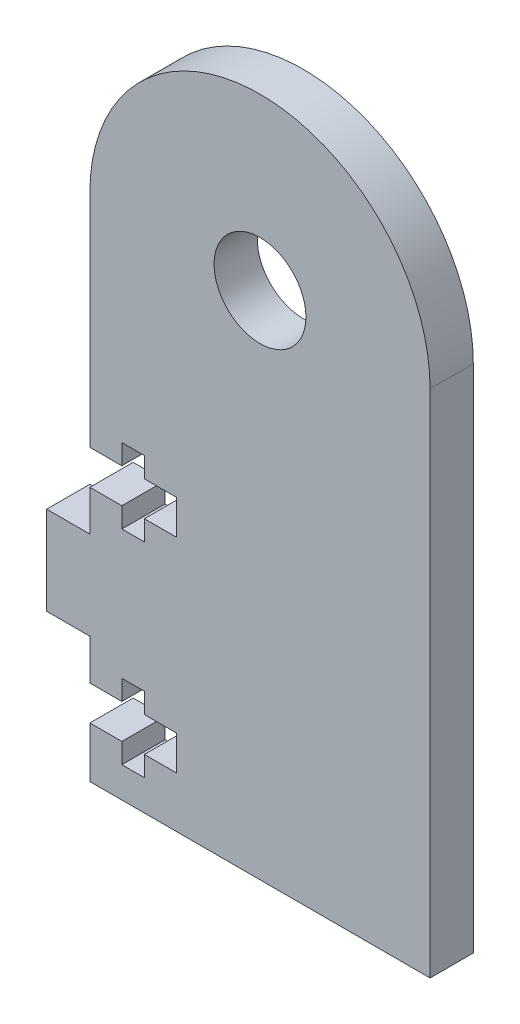
ISO-10303-21;
HEADER;
FILE_DESCRIPTION(('STEP AP214'),'2;1');
FILE_NAME('part.step','',(''),(''),'','','');
FILE_SCHEMA(('AUTOMOTIVE_DESIGN { 1 0 10303 214 1 1 1 1 }'));
ENDSEC;
DATA;
#1=APPLICATION_CONTEXT('core data for automotive mechanical design processes');
#2=APPLICATION_PROTOCOL_DEFINITION('international standard','automotive_design',2000,#1);
#3=PRODUCT_CONTEXT('',#1,'mechanical');
#4=PRODUCT('Part','Part','',(#3));
#5=PRODUCT_RELATED_PRODUCT_CATEGORY('part','',(#4));
#6=PRODUCT_DEFINITION_FORMATION('','',#4);
#7=PRODUCT_DEFINITION_CONTEXT('part definition',#1,'design');
#8=PRODUCT_DEFINITION('design','',#6,#7);
#9=PRODUCT_DEFINITION_SHAPE('','',#8);
#10=(LENGTH_UNIT() NAMED_UNIT(*) SI_UNIT(.MILLI.,.METRE.));
#11=(NAMED_UNIT(*) PLANE_ANGLE_UNIT() SI_UNIT($,.RADIAN.));
#12=(NAMED_UNIT(*) SI_UNIT($,.STERADIAN.) SOLID_ANGLE_UNIT());
#13=UNCERTAINTY_MEASURE_WITH_UNIT(LENGTH_MEASURE(1.E-05),#10,'distance_accuracy_value','');
#14=(GEOMETRIC_REPRESENTATION_CONTEXT(3) GLOBAL_UNCERTAINTY_ASSIGNED_CONTEXT((#13)) GLOBAL_UNIT_ASSIGNED_CONTEXT((#10,
#11,#12)) REPRESENTATION_CONTEXT('',''));
#15=CARTESIAN_POINT('',(0.,0.,0.));
#16=DIRECTION('',(0.,0.,1.));
#17=DIRECTION('',(1.,0.,0.));
#18=AXIS2_PLACEMENT_3D('',#15,#16,#17);
#19=CARTESIAN_POINT('',(-25.,0.,6.35));
#20=DIRECTION('',(1.,0.,0.));
#21=DIRECTION('',(0.,1.,0.));
#22=AXIS2_PLACEMENT_3D('',#19,#20,#21);
#23=PLANE('',#22);
#24=DIRECTION('',(0.,-1.,0.));
#25=VECTOR('',#24,1.);
#26=CARTESIAN_POINT('',(-25.,0.,6.35));
#27=LINE('',#26,#25);
#28=CARTESIAN_POINT('',(-25.,-56.5,6.35));
#29=VERTEX_POINT('',#28);
#30=CARTESIAN_POINT('',(-25.,-62.46,6.35));
#31=VERTEX_POINT('',#30);
#32=EDGE_CURVE('E48',#29,#31,#27,.T.);
#33=ORIENTED_EDGE('',*,*,#32,.F.);
#34=DIRECTION('',(0.,0.,1.));
#35=VECTOR('',#34,1.);
#36=CARTESIAN_POINT('',(-25.,-56.5,0.));
#37=LINE('',#36,#35);
#38=CARTESIAN_POINT('',(-25.,-56.5,0.));
#39=VERTEX_POINT('',#38);
#40=EDGE_CURVE('E279',#39,#29,#37,.T.);
#41=ORIENTED_EDGE('',*,*,#40,.F.);
#42=DIRECTION('',(0.,-1.,0.));
#43=VECTOR('',#42,1.);
#44=CARTESIAN_POINT('',(-25.,0.,0.));
#45=LINE('',#44,#43);
#46=CARTESIAN_POINT('',(-25.,-62.46,0.));
#47=VERTEX_POINT('',#46);
#48=EDGE_CURVE('E486',#39,#47,#45,.T.);
#49=ORIENTED_EDGE('',*,*,#48,.T.);
#50=DIRECTION('',(0.,0.,1.));
#51=VECTOR('',#50,1.);
#52=CARTESIAN_POINT('',(-25.,-62.46,0.));
#53=LINE('',#52,#51);
#54=EDGE_CURVE('E453',#47,#31,#53,.T.);
#55=ORIENTED_EDGE('',*,*,#54,.T.);
#56=EDGE_LOOP('',(#33,#41,#49,#55));
#57=FACE_BOUND('',#56,.T.);
#58=ADVANCED_FACE('F33',(#57),#23,.F.);
#59=CARTESIAN_POINT('',(-25.,-37.54,0.));
#60=VERTEX_POINT('',#59);
#61=CARTESIAN_POINT('',(-25.,-43.5,0.));
#62=VERTEX_POINT('',#61);
#63=EDGE_CURVE('E485',#60,#62,#45,.T.);
#64=ORIENTED_EDGE('',*,*,#63,.T.);
#65=DIRECTION('',(0.,0.,1.));
#66=VECTOR('',#65,1.);
#67=CARTESIAN_POINT('',(-25.,-43.5,0.));
#68=LINE('',#67,#66);
#69=CARTESIAN_POINT('',(-25.,-43.5,6.35));
#70=VERTEX_POINT('',#69);
#71=EDGE_CURVE('E56',#62,#70,#68,.T.);
#72=ORIENTED_EDGE('',*,*,#71,.T.);
#73=CARTESIAN_POINT('',(-25.,-37.54,6.35));
#74=VERTEX_POINT('',#73);
#75=EDGE_CURVE('E473',#74,#70,#27,.T.);
#76=ORIENTED_EDGE('',*,*,#75,.F.);
#77=DIRECTION('',(0.,0.,1.));
#78=VECTOR('',#77,1.);
#79=CARTESIAN_POINT('',(-25.,-37.54,0.));
#80=LINE('',#79,#78);
#81=EDGE_CURVE('E360',#60,#74,#80,.T.);
#82=ORIENTED_EDGE('',*,*,#81,.F.);
#83=EDGE_LOOP('',(#64,#72,#76,#82));
#84=FACE_BOUND('',#83,.T.);
#85=ADVANCED_FACE('F521',(#84),#23,.F.);
#86=CARTESIAN_POINT('',(-25.,-67.54,6.35));
#87=VERTEX_POINT('',#86);
#88=CARTESIAN_POINT('',(-25.,-75.,6.35));
#89=VERTEX_POINT('',#88);
#90=EDGE_CURVE('E467',#87,#89,#27,.T.);
#91=ORIENTED_EDGE('',*,*,#90,.F.);
#92=DIRECTION('',(0.,0.,1.));
#93=VECTOR('',#92,1.);
#94=CARTESIAN_POINT('',(-25.,-67.54,0.));
#95=LINE('',#94,#93);
#96=CARTESIAN_POINT('',(-25.,-67.54,0.));
#97=VERTEX_POINT('',#96);
#98=EDGE_CURVE('E451',#97,#87,#95,.T.);
#99=ORIENTED_EDGE('',*,*,#98,.F.);
#100=CARTESIAN_POINT('',(-25.,-75.,0.));
#101=VERTEX_POINT('',#100);
#102=EDGE_CURVE('E480',#97,#101,#45,.T.);
#103=ORIENTED_EDGE('',*,*,#102,.T.);
#104=DIRECTION('',(0.,0.,-1.));
#105=VECTOR('',#104,1.);
#106=CARTESIAN_POINT('',(-25.,-75.,6.35));
#107=LINE('',#106,#105);
#108=EDGE_CURVE('E41',#89,#101,#107,.T.);
#109=ORIENTED_EDGE('',*,*,#108,.F.);
#110=EDGE_LOOP('',(#91,#99,#103,#109));
#111=FACE_BOUND('',#110,.T.);
#112=ADVANCED_FACE('F523',(#111),#23,.F.);
#113=CARTESIAN_POINT('',(0.,0.,6.35));
#114=DIRECTION('',(0.,0.,-1.));
#115=DIRECTION('',(-1.,0.,0.));
#116=AXIS2_PLACEMENT_3D('',#113,#114,#115);
#117=CYLINDRICAL_SURFACE('',#116,25.);
#118=CARTESIAN_POINT('',(0.,0.,0.));
#119=DIRECTION('',(0.,0.,1.));
#120=DIRECTION('',(1.,0.,0.));
#121=AXIS2_PLACEMENT_3D('',#118,#119,#120);
#122=CIRCLE('',#121,25.);
#123=CARTESIAN_POINT('',(25.,0.,0.));
#124=VERTEX_POINT('',#123);
#125=CARTESIAN_POINT('',(-25.,0.,0.));
#126=VERTEX_POINT('',#125);
#127=EDGE_CURVE('E442',#124,#126,#122,.T.);
#128=ORIENTED_EDGE('',*,*,#127,.T.);
#129=DIRECTION('',(0.,0.,-1.));
#130=VECTOR('',#129,1.);
#131=CARTESIAN_POINT('',(-25.,0.,6.35));
#132=LINE('',#131,#130);
#133=CARTESIAN_POINT('',(-25.,0.,6.35));
#134=VERTEX_POINT('',#133);
#135=EDGE_CURVE('E11',#134,#126,#132,.T.);
#136=ORIENTED_EDGE('',*,*,#135,.F.);
#137=CARTESIAN_POINT('',(0.,0.,6.35));
#138=DIRECTION('',(0.,0.,1.));
#139=DIRECTION('',(1.,0.,0.));
#140=AXIS2_PLACEMENT_3D('',#137,#138,#139);
#141=CIRCLE('',#140,25.);
#142=CARTESIAN_POINT('',(25.,0.,6.35));
#143=VERTEX_POINT('',#142);
#144=EDGE_CURVE('E464',#143,#134,#141,.T.);
#145=ORIENTED_EDGE('',*,*,#144,.F.);
#146=DIRECTION('',(0.,0.,-1.));
#147=VECTOR('',#146,1.);
#148=CARTESIAN_POINT('',(25.,0.,6.35));
#149=LINE('',#148,#147);
#150=EDGE_CURVE('E477',#143,#124,#149,.T.);
#151=ORIENTED_EDGE('',*,*,#150,.T.);
#152=EDGE_LOOP('',(#128,#136,#145,#151));
#153=FACE_BOUND('',#152,.T.);
#154=ADVANCED_FACE('F35',(#153),#117,.T.);
#155=CARTESIAN_POINT('',(-25.,-32.46,0.));
#156=VERTEX_POINT('',#155);
#157=EDGE_CURVE('E481',#126,#156,#45,.T.);
#158=ORIENTED_EDGE('',*,*,#157,.T.);
#159=DIRECTION('',(0.,0.,1.));
#160=VECTOR('',#159,1.);
#161=CARTESIAN_POINT('',(-25.,-32.46,0.));
#162=LINE('',#161,#160);
#163=CARTESIAN_POINT('',(-25.,-32.46,6.35));
#164=VERTEX_POINT('',#163);
#165=EDGE_CURVE('E362',#156,#164,#162,.T.);
#166=ORIENTED_EDGE('',*,*,#165,.T.);
#167=EDGE_CURVE('E469',#134,#164,#27,.T.);
#168=ORIENTED_EDGE('',*,*,#167,.F.);
#169=ORIENTED_EDGE('',*,*,#135,.T.);
#170=EDGE_LOOP('',(#158,#166,#168,#169));
#171=FACE_BOUND('',#170,.T.);
#172=ADVANCED_FACE('F582',(#171),#23,.F.);
#173=CARTESIAN_POINT('',(-25.,-75.,6.35));
#174=DIRECTION('',(0.,1.,0.));
#175=DIRECTION('',(0.,0.,1.));
#176=AXIS2_PLACEMENT_3D('',#173,#174,#175);
#177=PLANE('',#176);
#178=DIRECTION('',(1.,0.,0.));
#179=VECTOR('',#178,1.);
#180=CARTESIAN_POINT('',(-25.,-75.,0.));
#181=LINE('',#180,#179);
#182=CARTESIAN_POINT('',(25.,-75.,0.));
#183=VERTEX_POINT('',#182);
#184=EDGE_CURVE('E484',#101,#183,#181,.T.);
#185=ORIENTED_EDGE('',*,*,#184,.T.);
#186=DIRECTION('',(0.,0.,-1.));
#187=VECTOR('',#186,1.);
#188=CARTESIAN_POINT('',(25.,-75.,6.35));
#189=LINE('',#188,#187);
#190=CARTESIAN_POINT('',(25.,-75.,6.35));
#191=VERTEX_POINT('',#190);
#192=EDGE_CURVE('E491',#191,#183,#189,.T.);
#193=ORIENTED_EDGE('',*,*,#192,.F.);
#194=DIRECTION('',(1.,0.,0.));
#195=VECTOR('',#194,1.);
#196=CARTESIAN_POINT('',(-25.,-75.,6.35));
#197=LINE('',#196,#195);
#198=EDGE_CURVE('E472',#89,#191,#197,.T.);
#199=ORIENTED_EDGE('',*,*,#198,.F.);
#200=ORIENTED_EDGE('',*,*,#108,.T.);
#201=EDGE_LOOP('',(#185,#193,#199,#200));
#202=FACE_BOUND('',#201,.T.);
#203=ADVANCED_FACE('F498',(#202),#177,.F.);
#204=CARTESIAN_POINT('',(25.,0.,6.35));
#205=DIRECTION('',(-1.,0.,0.));
#206=DIRECTION('',(0.,-1.,0.));
#207=AXIS2_PLACEMENT_3D('',#204,#205,#206);
#208=PLANE('',#207);
#209=DIRECTION('',(0.,1.,0.));
#210=VECTOR('',#209,1.);
#211=CARTESIAN_POINT('',(25.,0.,0.));
#212=LINE('',#211,#210);
#213=EDGE_CURVE('E468',#183,#124,#212,.T.);
#214=ORIENTED_EDGE('',*,*,#213,.T.);
#215=ORIENTED_EDGE('',*,*,#150,.F.);
#216=DIRECTION('',(0.,1.,0.));
#217=VECTOR('',#216,1.);
#218=CARTESIAN_POINT('',(25.,0.,6.35));
#219=LINE('',#218,#217);
#220=EDGE_CURVE('E475',#191,#143,#219,.T.);
#221=ORIENTED_EDGE('',*,*,#220,.F.);
#222=ORIENTED_EDGE('',*,*,#192,.T.);
#223=EDGE_LOOP('',(#214,#215,#221,#222));
#224=FACE_BOUND('',#223,.T.);
#225=ADVANCED_FACE('F507',(#224),#208,.F.);
#226=CARTESIAN_POINT('',(0.,0.,6.35));
#227=DIRECTION('',(0.,0.,1.));
#228=DIRECTION('',(1.,0.,0.));
#229=AXIS2_PLACEMENT_3D('',#226,#227,#228);
#230=PLANE('',#229);
#231=CARTESIAN_POINT('',(0.,0.,6.35));
#232=DIRECTION('',(0.,0.,1.));
#233=DIRECTION('',(1.,0.,0.));
#234=AXIS2_PLACEMENT_3D('',#231,#232,#233);
#235=CIRCLE('',#234,6.75);
#236=CARTESIAN_POINT('',(6.75,0.,6.35));
#237=VERTEX_POINT('',#236);
#238=EDGE_CURVE('E271',#237,#237,#235,.T.);
#239=ORIENTED_EDGE('',*,*,#238,.F.);
#240=EDGE_LOOP('',(#239));
#241=FACE_BOUND('',#240,.T.);
#242=DIRECTION('',(1.,0.,0.));
#243=VECTOR('',#242,1.);
#244=CARTESIAN_POINT('',(-20.301,-37.54,6.35));
#245=LINE('',#244,#243);
#246=CARTESIAN_POINT('',(-20.301,-37.54,6.35));
#247=VERTEX_POINT('',#246);
#248=EDGE_CURVE('E335',#74,#247,#245,.T.);
#249=ORIENTED_EDGE('',*,*,#248,.F.);
#250=ORIENTED_EDGE('',*,*,#75,.T.);
#251=DIRECTION('',(-1.,0.,0.));
#252=VECTOR('',#251,1.);
#253=CARTESIAN_POINT('',(-25.,-43.5,6.35));
#254=LINE('',#253,#252);
#255=CARTESIAN_POINT('',(-31.35,-43.5,6.35));
#256=VERTEX_POINT('',#255);
#257=EDGE_CURVE('E275',#70,#256,#254,.T.);
#258=ORIENTED_EDGE('',*,*,#257,.T.);
#259=DIRECTION('',(0.,-1.,0.));
#260=VECTOR('',#259,1.);
#261=CARTESIAN_POINT('',(-31.35,-43.5,6.35));
#262=LINE('',#261,#260);
#263=CARTESIAN_POINT('',(-31.35,-56.5,6.35));
#264=VERTEX_POINT('',#263);
#265=EDGE_CURVE('E250',#256,#264,#262,.T.);
#266=ORIENTED_EDGE('',*,*,#265,.T.);
#267=DIRECTION('',(1.,0.,0.));
#268=VECTOR('',#267,1.);
#269=CARTESIAN_POINT('',(-25.,-56.5,6.35));
#270=LINE('',#269,#268);
#271=EDGE_CURVE('E266',#264,#29,#270,.T.);
#272=ORIENTED_EDGE('',*,*,#271,.T.);
#273=ORIENTED_EDGE('',*,*,#32,.T.);
#274=DIRECTION('',(-1.,0.,0.));
#275=VECTOR('',#274,1.);
#276=CARTESIAN_POINT('',(-20.301,-62.46,6.35));
#277=LINE('',#276,#275);
#278=CARTESIAN_POINT('',(-20.301,-62.46,6.35));
#279=VERTEX_POINT('',#278);
#280=EDGE_CURVE('E423',#279,#31,#277,.T.);
#281=ORIENTED_EDGE('',*,*,#280,.F.);
#282=DIRECTION('',(0.,-1.,0.));
#283=VECTOR('',#282,1.);
#284=CARTESIAN_POINT('',(-20.301,-62.46,6.35));
#285=LINE('',#284,#283);
#286=CARTESIAN_POINT('',(-20.301,-59.5009,6.35));
#287=VERTEX_POINT('',#286);
#288=EDGE_CURVE('E420',#287,#279,#285,.T.);
#289=ORIENTED_EDGE('',*,*,#288,.F.);
#290=DIRECTION('',(-1.,0.,0.));
#291=VECTOR('',#290,1.);
#292=CARTESIAN_POINT('',(-20.301,-59.5009,6.35));
#293=LINE('',#292,#291);
#294=CARTESIAN_POINT('',(-16.999,-59.5009,6.35));
#295=VERTEX_POINT('',#294);
#296=EDGE_CURVE('E417',#295,#287,#293,.T.);
#297=ORIENTED_EDGE('',*,*,#296,.F.);
#298=DIRECTION('',(0.,1.,0.));
#299=VECTOR('',#298,1.);
#300=CARTESIAN_POINT('',(-16.999,-62.46,6.35));
#301=LINE('',#300,#299);
#302=CARTESIAN_POINT('',(-16.999,-62.46,6.35));
#303=VERTEX_POINT('',#302);
#304=EDGE_CURVE('E414',#303,#295,#301,.T.);
#305=ORIENTED_EDGE('',*,*,#304,.F.);
#306=DIRECTION('',(-1.,0.,0.));
#307=VECTOR('',#306,1.);
#308=CARTESIAN_POINT('',(-12.3,-62.46,6.35));
#309=LINE('',#308,#307);
#310=CARTESIAN_POINT('',(-12.3,-62.46,6.35));
#311=VERTEX_POINT('',#310);
#312=EDGE_CURVE('E411',#311,#303,#309,.T.);
#313=ORIENTED_EDGE('',*,*,#312,.F.);
#314=DIRECTION('',(0.,1.,0.));
#315=VECTOR('',#314,1.);
#316=CARTESIAN_POINT('',(-12.3,-62.46,6.35));
#317=LINE('',#316,#315);
#318=CARTESIAN_POINT('',(-12.3,-67.54,6.35));
#319=VERTEX_POINT('',#318);
#320=EDGE_CURVE('E351',#319,#311,#317,.T.);
#321=ORIENTED_EDGE('',*,*,#320,.F.);
#322=DIRECTION('',(1.,0.,0.));
#323=VECTOR('',#322,1.);
#324=CARTESIAN_POINT('',(-12.3,-67.54,6.35));
#325=LINE('',#324,#323);
#326=CARTESIAN_POINT('',(-16.999,-67.54,6.35));
#327=VERTEX_POINT('',#326);
#328=EDGE_CURVE('E378',#327,#319,#325,.T.);
#329=ORIENTED_EDGE('',*,*,#328,.F.);
#330=DIRECTION('',(0.,1.,0.));
#331=VECTOR('',#330,1.);
#332=CARTESIAN_POINT('',(-16.999,-70.4991,6.35));
#333=LINE('',#332,#331);
#334=CARTESIAN_POINT('',(-16.999,-70.4991,6.35));
#335=VERTEX_POINT('',#334);
#336=EDGE_CURVE('E435',#335,#327,#333,.T.);
#337=ORIENTED_EDGE('',*,*,#336,.F.);
#338=DIRECTION('',(1.,0.,0.));
#339=VECTOR('',#338,1.);
#340=CARTESIAN_POINT('',(-20.301,-70.4991,6.35));
#341=LINE('',#340,#339);
#342=CARTESIAN_POINT('',(-20.301,-70.4991,6.35));
#343=VERTEX_POINT('',#342);
#344=EDGE_CURVE('E432',#343,#335,#341,.T.);
#345=ORIENTED_EDGE('',*,*,#344,.F.);
#346=DIRECTION('',(0.,-1.,0.));
#347=VECTOR('',#346,1.);
#348=CARTESIAN_POINT('',(-20.301,-70.4991,6.35));
#349=LINE('',#348,#347);
#350=CARTESIAN_POINT('',(-20.301,-67.54,6.35));
#351=VERTEX_POINT('',#350);
#352=EDGE_CURVE('E429',#351,#343,#349,.T.);
#353=ORIENTED_EDGE('',*,*,#352,.F.);
#354=DIRECTION('',(1.,0.,0.));
#355=VECTOR('',#354,1.);
#356=CARTESIAN_POINT('',(-20.301,-67.54,6.35));
#357=LINE('',#356,#355);
#358=EDGE_CURVE('E426',#87,#351,#357,.T.);
#359=ORIENTED_EDGE('',*,*,#358,.F.);
#360=ORIENTED_EDGE('',*,*,#90,.T.);
#361=ORIENTED_EDGE('',*,*,#198,.T.);
#362=ORIENTED_EDGE('',*,*,#220,.T.);
#363=ORIENTED_EDGE('',*,*,#144,.T.);
#364=ORIENTED_EDGE('',*,*,#167,.T.);
#365=DIRECTION('',(-1.,0.,0.));
#366=VECTOR('',#365,1.);
#367=CARTESIAN_POINT('',(-20.301,-32.46,6.35));
#368=LINE('',#367,#366);
#369=CARTESIAN_POINT('',(-20.301,-32.46,6.35));
#370=VERTEX_POINT('',#369);
#371=EDGE_CURVE('E333',#370,#164,#368,.T.);
#372=ORIENTED_EDGE('',*,*,#371,.F.);
#373=DIRECTION('',(0.,-1.,0.));
#374=VECTOR('',#373,1.);
#375=CARTESIAN_POINT('',(-20.301,-32.46,6.35));
#376=LINE('',#375,#374);
#377=CARTESIAN_POINT('',(-20.301,-29.5009,6.35));
#378=VERTEX_POINT('',#377);
#379=EDGE_CURVE('E330',#378,#370,#376,.T.);
#380=ORIENTED_EDGE('',*,*,#379,.F.);
#381=DIRECTION('',(-1.,0.,0.));
#382=VECTOR('',#381,1.);
#383=CARTESIAN_POINT('',(-20.301,-29.5009,6.35));
#384=LINE('',#383,#382);
#385=CARTESIAN_POINT('',(-16.999,-29.5009,6.35));
#386=VERTEX_POINT('',#385);
#387=EDGE_CURVE('E327',#386,#378,#384,.T.);
#388=ORIENTED_EDGE('',*,*,#387,.F.);
#389=DIRECTION('',(0.,1.,0.));
#390=VECTOR('',#389,1.);
#391=CARTESIAN_POINT('',(-16.999,-32.46,6.35));
#392=LINE('',#391,#390);
#393=CARTESIAN_POINT('',(-16.999,-32.46,6.35));
#394=VERTEX_POINT('',#393);
#395=EDGE_CURVE('E324',#394,#386,#392,.T.);
#396=ORIENTED_EDGE('',*,*,#395,.F.);
#397=DIRECTION('',(-1.,0.,0.));
#398=VECTOR('',#397,1.);
#399=CARTESIAN_POINT('',(-12.3,-32.46,6.35));
#400=LINE('',#399,#398);
#401=CARTESIAN_POINT('',(-12.3,-32.46,6.35));
#402=VERTEX_POINT('',#401);
#403=EDGE_CURVE('E321',#402,#394,#400,.T.);
#404=ORIENTED_EDGE('',*,*,#403,.F.);
#405=DIRECTION('',(0.,1.,0.));
#406=VECTOR('',#405,1.);
#407=CARTESIAN_POINT('',(-12.3,-32.46,6.35));
#408=LINE('',#407,#406);
#409=CARTESIAN_POINT('',(-12.3,-37.54,6.35));
#410=VERTEX_POINT('',#409);
#411=EDGE_CURVE('E281',#410,#402,#408,.T.);
#412=ORIENTED_EDGE('',*,*,#411,.F.);
#413=DIRECTION('',(1.,0.,0.));
#414=VECTOR('',#413,1.);
#415=CARTESIAN_POINT('',(-12.3,-37.54,6.35));
#416=LINE('',#415,#414);
#417=CARTESIAN_POINT('',(-16.999,-37.54,6.35));
#418=VERTEX_POINT('',#417);
#419=EDGE_CURVE('E288',#418,#410,#416,.T.);
#420=ORIENTED_EDGE('',*,*,#419,.F.);
#421=DIRECTION('',(0.,1.,0.));
#422=VECTOR('',#421,1.);
#423=CARTESIAN_POINT('',(-16.999,-40.4991,6.35));
#424=LINE('',#423,#422);
#425=CARTESIAN_POINT('',(-16.999,-40.4991,6.35));
#426=VERTEX_POINT('',#425);
#427=EDGE_CURVE('E344',#426,#418,#424,.T.);
#428=ORIENTED_EDGE('',*,*,#427,.F.);
#429=DIRECTION('',(1.,0.,0.));
#430=VECTOR('',#429,1.);
#431=CARTESIAN_POINT('',(-20.301,-40.4991,6.35));
#432=LINE('',#431,#430);
#433=CARTESIAN_POINT('',(-20.301,-40.4991,6.35));
#434=VERTEX_POINT('',#433);
#435=EDGE_CURVE('E341',#434,#426,#432,.T.);
#436=ORIENTED_EDGE('',*,*,#435,.F.);
#437=DIRECTION('',(0.,-1.,0.));
#438=VECTOR('',#437,1.);
#439=CARTESIAN_POINT('',(-20.301,-40.4991,6.35));
#440=LINE('',#439,#438);
#441=EDGE_CURVE('E338',#247,#434,#440,.T.);
#442=ORIENTED_EDGE('',*,*,#441,.F.);
#443=EDGE_LOOP('',(#249,#250,#258,#266,#272,#273,#281,#289,#297,#305,#313,#321,#329,#337,#345,
#353,#359,#360,#361,#362,#363,#364,#372,#380,#388,#396,#404,#412,#420,#428,#436,#442));
#444=FACE_BOUND('',#443,.T.);
#445=ADVANCED_FACE('F514',(#241,#444),#230,.T.);
#446=CARTESIAN_POINT('',(0.,0.,0.));
#447=DIRECTION('',(0.,0.,1.));
#448=DIRECTION('',(1.,0.,0.));
#449=AXIS2_PLACEMENT_3D('',#446,#447,#448);
#450=PLANE('',#449);
#451=CARTESIAN_POINT('',(0.,0.,0.));
#452=DIRECTION('',(0.,0.,1.));
#453=DIRECTION('',(1.,0.,0.));
#454=AXIS2_PLACEMENT_3D('',#451,#452,#453);
#455=CIRCLE('',#454,6.75);
#456=CARTESIAN_POINT('',(6.75,0.,0.));
#457=VERTEX_POINT('',#456);
#458=EDGE_CURVE('E277',#457,#457,#455,.T.);
#459=ORIENTED_EDGE('',*,*,#458,.T.);
#460=EDGE_LOOP('',(#459));
#461=FACE_BOUND('',#460,.T.);
#462=ORIENTED_EDGE('',*,*,#63,.F.);
#463=DIRECTION('',(1.,0.,0.));
#464=VECTOR('',#463,1.);
#465=CARTESIAN_POINT('',(-20.301,-37.54,0.));
#466=LINE('',#465,#464);
#467=CARTESIAN_POINT('',(-20.301,-37.54,0.));
#468=VERTEX_POINT('',#467);
#469=EDGE_CURVE('E303',#60,#468,#466,.T.);
#470=ORIENTED_EDGE('',*,*,#469,.T.);
#471=DIRECTION('',(0.,-1.,0.));
#472=VECTOR('',#471,1.);
#473=CARTESIAN_POINT('',(-20.301,-40.4991,0.));
#474=LINE('',#473,#472);
#475=CARTESIAN_POINT('',(-20.301,-40.4991,0.));
#476=VERTEX_POINT('',#475);
#477=EDGE_CURVE('E306',#468,#476,#474,.T.);
#478=ORIENTED_EDGE('',*,*,#477,.T.);
#479=DIRECTION('',(1.,0.,0.));
#480=VECTOR('',#479,1.);
#481=CARTESIAN_POINT('',(-20.301,-40.4991,0.));
#482=LINE('',#481,#480);
#483=CARTESIAN_POINT('',(-16.999,-40.4991,0.));
#484=VERTEX_POINT('',#483);
#485=EDGE_CURVE('E309',#476,#484,#482,.T.);
#486=ORIENTED_EDGE('',*,*,#485,.T.);
#487=DIRECTION('',(0.,1.,0.));
#488=VECTOR('',#487,1.);
#489=CARTESIAN_POINT('',(-16.999,-40.4991,0.));
#490=LINE('',#489,#488);
#491=CARTESIAN_POINT('',(-16.999,-37.54,0.));
#492=VERTEX_POINT('',#491);
#493=EDGE_CURVE('E312',#484,#492,#490,.T.);
#494=ORIENTED_EDGE('',*,*,#493,.T.);
#495=DIRECTION('',(1.,0.,0.));
#496=VECTOR('',#495,1.);
#497=CARTESIAN_POINT('',(-12.3,-37.54,0.));
#498=LINE('',#497,#496);
#499=CARTESIAN_POINT('',(-12.3,-37.54,0.));
#500=VERTEX_POINT('',#499);
#501=EDGE_CURVE('E315',#492,#500,#498,.T.);
#502=ORIENTED_EDGE('',*,*,#501,.T.);
#503=DIRECTION('',(0.,1.,0.));
#504=VECTOR('',#503,1.);
#505=CARTESIAN_POINT('',(-12.3,-32.46,0.));
#506=LINE('',#505,#504);
#507=CARTESIAN_POINT('',(-12.3,-32.46,0.));
#508=VERTEX_POINT('',#507);
#509=EDGE_CURVE('E284',#500,#508,#506,.T.);
#510=ORIENTED_EDGE('',*,*,#509,.T.);
#511=DIRECTION('',(-1.,0.,0.));
#512=VECTOR('',#511,1.);
#513=CARTESIAN_POINT('',(-12.3,-32.46,0.));
#514=LINE('',#513,#512);
#515=CARTESIAN_POINT('',(-16.999,-32.46,0.));
#516=VERTEX_POINT('',#515);
#517=EDGE_CURVE('E287',#508,#516,#514,.T.);
#518=ORIENTED_EDGE('',*,*,#517,.T.);
#519=DIRECTION('',(0.,1.,0.));
#520=VECTOR('',#519,1.);
#521=CARTESIAN_POINT('',(-16.999,-32.46,0.));
#522=LINE('',#521,#520);
#523=CARTESIAN_POINT('',(-16.999,-29.5009,0.));
#524=VERTEX_POINT('',#523);
#525=EDGE_CURVE('E291',#516,#524,#522,.T.);
#526=ORIENTED_EDGE('',*,*,#525,.T.);
#527=DIRECTION('',(-1.,0.,0.));
#528=VECTOR('',#527,1.);
#529=CARTESIAN_POINT('',(-20.301,-29.5009,0.));
#530=LINE('',#529,#528);
#531=CARTESIAN_POINT('',(-20.301,-29.5009,0.));
#532=VERTEX_POINT('',#531);
#533=EDGE_CURVE('E294',#524,#532,#530,.T.);
#534=ORIENTED_EDGE('',*,*,#533,.T.);
#535=DIRECTION('',(0.,-1.,0.));
#536=VECTOR('',#535,1.);
#537=CARTESIAN_POINT('',(-20.301,-32.46,0.));
#538=LINE('',#537,#536);
#539=CARTESIAN_POINT('',(-20.301,-32.46,0.));
#540=VERTEX_POINT('',#539);
#541=EDGE_CURVE('E297',#532,#540,#538,.T.);
#542=ORIENTED_EDGE('',*,*,#541,.T.);
#543=DIRECTION('',(-1.,0.,0.));
#544=VECTOR('',#543,1.);
#545=CARTESIAN_POINT('',(-20.301,-32.46,0.));
#546=LINE('',#545,#544);
#547=EDGE_CURVE('E300',#540,#156,#546,.T.);
#548=ORIENTED_EDGE('',*,*,#547,.T.);
#549=ORIENTED_EDGE('',*,*,#157,.F.);
#550=ORIENTED_EDGE('',*,*,#127,.F.);
#551=ORIENTED_EDGE('',*,*,#213,.F.);
#552=ORIENTED_EDGE('',*,*,#184,.F.);
#553=ORIENTED_EDGE('',*,*,#102,.F.);
#554=DIRECTION('',(1.,0.,0.));
#555=VECTOR('',#554,1.);
#556=CARTESIAN_POINT('',(-20.301,-67.54,0.));
#557=LINE('',#556,#555);
#558=CARTESIAN_POINT('',(-20.301,-67.54,0.));
#559=VERTEX_POINT('',#558);
#560=EDGE_CURVE('E393',#97,#559,#557,.T.);
#561=ORIENTED_EDGE('',*,*,#560,.T.);
#562=DIRECTION('',(0.,-1.,0.));
#563=VECTOR('',#562,1.);
#564=CARTESIAN_POINT('',(-20.301,-70.4991,0.));
#565=LINE('',#564,#563);
#566=CARTESIAN_POINT('',(-20.301,-70.4991,0.));
#567=VERTEX_POINT('',#566);
#568=EDGE_CURVE('E396',#559,#567,#565,.T.);
#569=ORIENTED_EDGE('',*,*,#568,.T.);
#570=DIRECTION('',(1.,0.,0.));
#571=VECTOR('',#570,1.);
#572=CARTESIAN_POINT('',(-20.301,-70.4991,0.));
#573=LINE('',#572,#571);
#574=CARTESIAN_POINT('',(-16.999,-70.4991,0.));
#575=VERTEX_POINT('',#574);
#576=EDGE_CURVE('E399',#567,#575,#573,.T.);
#577=ORIENTED_EDGE('',*,*,#576,.T.);
#578=DIRECTION('',(0.,1.,0.));
#579=VECTOR('',#578,1.);
#580=CARTESIAN_POINT('',(-16.999,-70.4991,0.));
#581=LINE('',#580,#579);
#582=CARTESIAN_POINT('',(-16.999,-67.54,0.));
#583=VERTEX_POINT('',#582);
#584=EDGE_CURVE('E402',#575,#583,#581,.T.);
#585=ORIENTED_EDGE('',*,*,#584,.T.);
#586=DIRECTION('',(1.,0.,0.));
#587=VECTOR('',#586,1.);
#588=CARTESIAN_POINT('',(-12.3,-67.54,0.));
#589=LINE('',#588,#587);
#590=CARTESIAN_POINT('',(-12.3,-67.54,0.));
#591=VERTEX_POINT('',#590);
#592=EDGE_CURVE('E405',#583,#591,#589,.T.);
#593=ORIENTED_EDGE('',*,*,#592,.T.);
#594=DIRECTION('',(0.,1.,0.));
#595=VECTOR('',#594,1.);
#596=CARTESIAN_POINT('',(-12.3,-62.46,0.));
#597=LINE('',#596,#595);
#598=CARTESIAN_POINT('',(-12.3,-62.46,0.));
#599=VERTEX_POINT('',#598);
#600=EDGE_CURVE('E374',#591,#599,#597,.T.);
#601=ORIENTED_EDGE('',*,*,#600,.T.);
#602=DIRECTION('',(-1.,0.,0.));
#603=VECTOR('',#602,1.);
#604=CARTESIAN_POINT('',(-12.3,-62.46,0.));
#605=LINE('',#604,#603);
#606=CARTESIAN_POINT('',(-16.999,-62.46,0.));
#607=VERTEX_POINT('',#606);
#608=EDGE_CURVE('E377',#599,#607,#605,.T.);
#609=ORIENTED_EDGE('',*,*,#608,.T.);
#610=DIRECTION('',(0.,1.,0.));
#611=VECTOR('',#610,1.);
#612=CARTESIAN_POINT('',(-16.999,-62.46,0.));
#613=LINE('',#612,#611);
#614=CARTESIAN_POINT('',(-16.999,-59.5009,0.));
#615=VERTEX_POINT('',#614);
#616=EDGE_CURVE('E381',#607,#615,#613,.T.);
#617=ORIENTED_EDGE('',*,*,#616,.T.);
#618=DIRECTION('',(-1.,0.,0.));
#619=VECTOR('',#618,1.);
#620=CARTESIAN_POINT('',(-20.301,-59.5009,0.));
#621=LINE('',#620,#619);
#622=CARTESIAN_POINT('',(-20.301,-59.5009,0.));
#623=VERTEX_POINT('',#622);
#624=EDGE_CURVE('E384',#615,#623,#621,.T.);
#625=ORIENTED_EDGE('',*,*,#624,.T.);
#626=DIRECTION('',(0.,-1.,0.));
#627=VECTOR('',#626,1.);
#628=CARTESIAN_POINT('',(-20.301,-62.46,0.));
#629=LINE('',#628,#627);
#630=CARTESIAN_POINT('',(-20.301,-62.46,0.));
#631=VERTEX_POINT('',#630);
#632=EDGE_CURVE('E387',#623,#631,#629,.T.);
#633=ORIENTED_EDGE('',*,*,#632,.T.);
#634=DIRECTION('',(-1.,0.,0.));
#635=VECTOR('',#634,1.);
#636=CARTESIAN_POINT('',(-20.301,-62.46,0.));
#637=LINE('',#636,#635);
#638=EDGE_CURVE('E390',#631,#47,#637,.T.);
#639=ORIENTED_EDGE('',*,*,#638,.T.);
#640=ORIENTED_EDGE('',*,*,#48,.F.);
#641=DIRECTION('',(1.,0.,0.));
#642=VECTOR('',#641,1.);
#643=CARTESIAN_POINT('',(-25.,-56.5,0.));
#644=LINE('',#643,#642);
#645=CARTESIAN_POINT('',(-31.35,-56.5,0.));
#646=VERTEX_POINT('',#645);
#647=EDGE_CURVE('E263',#646,#39,#644,.T.);
#648=ORIENTED_EDGE('',*,*,#647,.F.);
#649=DIRECTION('',(0.,-1.,0.));
#650=VECTOR('',#649,1.);
#651=CARTESIAN_POINT('',(-31.35,-43.5,0.));
#652=LINE('',#651,#650);
#653=CARTESIAN_POINT('',(-31.35,-43.5,0.));
#654=VERTEX_POINT('',#653);
#655=EDGE_CURVE('E247',#654,#646,#652,.T.);
#656=ORIENTED_EDGE('',*,*,#655,.F.);
#657=DIRECTION('',(-1.,0.,0.));
#658=VECTOR('',#657,1.);
#659=CARTESIAN_POINT('',(-25.,-43.5,0.));
#660=LINE('',#659,#658);
#661=EDGE_CURVE('E261',#62,#654,#660,.T.);
#662=ORIENTED_EDGE('',*,*,#661,.F.);
#663=EDGE_LOOP('',(#462,#470,#478,#486,#494,#502,#510,#518,#526,#534,#542,#548,#549,#550,#551,
#552,#553,#561,#569,#577,#585,#593,#601,#609,#617,#625,#633,#639,#640,#648,#656,#662));
#664=FACE_BOUND('',#663,.T.);
#665=ADVANCED_FACE('F260',(#461,#664),#450,.F.);
#666=CARTESIAN_POINT('',(-12.3,-62.46,0.));
#667=DIRECTION('',(1.,0.,0.));
#668=DIRECTION('',(0.,0.,-1.));
#669=AXIS2_PLACEMENT_3D('',#666,#667,#668);
#670=PLANE('',#669);
#671=ORIENTED_EDGE('',*,*,#320,.T.);
#672=DIRECTION('',(0.,0.,1.));
#673=VECTOR('',#672,1.);
#674=CARTESIAN_POINT('',(-12.3,-62.46,0.));
#675=LINE('',#674,#673);
#676=EDGE_CURVE('E408',#599,#311,#675,.T.);
#677=ORIENTED_EDGE('',*,*,#676,.F.);
#678=ORIENTED_EDGE('',*,*,#600,.F.);
#679=DIRECTION('',(0.,0.,1.));
#680=VECTOR('',#679,1.);
#681=CARTESIAN_POINT('',(-12.3,-67.54,0.));
#682=LINE('',#681,#680);
#683=EDGE_CURVE('E440',#591,#319,#682,.T.);
#684=ORIENTED_EDGE('',*,*,#683,.T.);
#685=EDGE_LOOP('',(#671,#677,#678,#684));
#686=FACE_BOUND('',#685,.T.);
#687=ADVANCED_FACE('F544',(#686),#670,.F.);
#688=CARTESIAN_POINT('',(-12.3,-67.54,0.));
#689=DIRECTION('',(0.,-1.,0.));
#690=DIRECTION('',(0.,0.,-1.));
#691=AXIS2_PLACEMENT_3D('',#688,#689,#690);
#692=PLANE('',#691);
#693=ORIENTED_EDGE('',*,*,#328,.T.);
#694=ORIENTED_EDGE('',*,*,#683,.F.);
#695=ORIENTED_EDGE('',*,*,#592,.F.);
#696=DIRECTION('',(0.,0.,1.));
#697=VECTOR('',#696,1.);
#698=CARTESIAN_POINT('',(-16.999,-67.54,0.));
#699=LINE('',#698,#697);
#700=EDGE_CURVE('E443',#583,#327,#699,.T.);
#701=ORIENTED_EDGE('',*,*,#700,.T.);
#702=EDGE_LOOP('',(#693,#694,#695,#701));
#703=FACE_BOUND('',#702,.T.);
#704=ADVANCED_FACE('F540',(#703),#692,.F.);
#705=CARTESIAN_POINT('',(-16.999,-70.4991,0.));
#706=DIRECTION('',(1.,0.,0.));
#707=DIRECTION('',(0.,0.,-1.));
#708=AXIS2_PLACEMENT_3D('',#705,#706,#707);
#709=PLANE('',#708);
#710=ORIENTED_EDGE('',*,*,#336,.T.);
#711=ORIENTED_EDGE('',*,*,#700,.F.);
#712=ORIENTED_EDGE('',*,*,#584,.F.);
#713=DIRECTION('',(0.,0.,1.));
#714=VECTOR('',#713,1.);
#715=CARTESIAN_POINT('',(-16.999,-70.4991,0.));
#716=LINE('',#715,#714);
#717=EDGE_CURVE('E445',#575,#335,#716,.T.);
#718=ORIENTED_EDGE('',*,*,#717,.T.);
#719=EDGE_LOOP('',(#710,#711,#712,#718));
#720=FACE_BOUND('',#719,.T.);
#721=ADVANCED_FACE('F536',(#720),#709,.F.);
#722=CARTESIAN_POINT('',(-20.301,-70.4991,0.));
#723=DIRECTION('',(0.,-1.,0.));
#724=DIRECTION('',(0.,0.,-1.));
#725=AXIS2_PLACEMENT_3D('',#722,#723,#724);
#726=PLANE('',#725);
#727=ORIENTED_EDGE('',*,*,#344,.T.);
#728=ORIENTED_EDGE('',*,*,#717,.F.);
#729=ORIENTED_EDGE('',*,*,#576,.F.);
#730=DIRECTION('',(0.,0.,1.));
#731=VECTOR('',#730,1.);
#732=CARTESIAN_POINT('',(-20.301,-70.4991,0.));
#733=LINE('',#732,#731);
#734=EDGE_CURVE('E447',#567,#343,#733,.T.);
#735=ORIENTED_EDGE('',*,*,#734,.T.);
#736=EDGE_LOOP('',(#727,#728,#729,#735));
#737=FACE_BOUND('',#736,.T.);
#738=ADVANCED_FACE('F532',(#737),#726,.F.);
#739=CARTESIAN_POINT('',(-20.301,-70.4991,0.));
#740=DIRECTION('',(-1.,0.,0.));
#741=DIRECTION('',(0.,0.,1.));
#742=AXIS2_PLACEMENT_3D('',#739,#740,#741);
#743=PLANE('',#742);
#744=ORIENTED_EDGE('',*,*,#352,.T.);
#745=ORIENTED_EDGE('',*,*,#734,.F.);
#746=ORIENTED_EDGE('',*,*,#568,.F.);
#747=DIRECTION('',(0.,0.,1.));
#748=VECTOR('',#747,1.);
#749=CARTESIAN_POINT('',(-20.301,-67.54,0.));
#750=LINE('',#749,#748);
#751=EDGE_CURVE('E449',#559,#351,#750,.T.);
#752=ORIENTED_EDGE('',*,*,#751,.T.);
#753=EDGE_LOOP('',(#744,#745,#746,#752));
#754=FACE_BOUND('',#753,.T.);
#755=ADVANCED_FACE('F529',(#754),#743,.F.);
#756=CARTESIAN_POINT('',(-20.301,-67.54,0.));
#757=DIRECTION('',(0.,-1.,0.));
#758=DIRECTION('',(0.,0.,-1.));
#759=AXIS2_PLACEMENT_3D('',#756,#757,#758);
#760=PLANE('',#759);
#761=ORIENTED_EDGE('',*,*,#358,.T.);
#762=ORIENTED_EDGE('',*,*,#751,.F.);
#763=ORIENTED_EDGE('',*,*,#560,.F.);
#764=ORIENTED_EDGE('',*,*,#98,.T.);
#765=EDGE_LOOP('',(#761,#762,#763,#764));
#766=FACE_BOUND('',#765,.T.);
#767=ADVANCED_FACE('F525',(#766),#760,.F.);
#768=CARTESIAN_POINT('',(-20.301,-62.46,0.));
#769=DIRECTION('',(0.,1.,0.));
#770=DIRECTION('',(0.,0.,1.));
#771=AXIS2_PLACEMENT_3D('',#768,#769,#770);
#772=PLANE('',#771);
#773=ORIENTED_EDGE('',*,*,#280,.T.);
#774=ORIENTED_EDGE('',*,*,#54,.F.);
#775=ORIENTED_EDGE('',*,*,#638,.F.);
#776=DIRECTION('',(0.,0.,1.));
#777=VECTOR('',#776,1.);
#778=CARTESIAN_POINT('',(-20.301,-62.46,0.));
#779=LINE('',#778,#777);
#780=EDGE_CURVE('E455',#631,#279,#779,.T.);
#781=ORIENTED_EDGE('',*,*,#780,.T.);
#782=EDGE_LOOP('',(#773,#774,#775,#781));
#783=FACE_BOUND('',#782,.T.);
#784=ADVANCED_FACE('F564',(#783),#772,.F.);
#785=CARTESIAN_POINT('',(-20.301,-62.46,0.));
#786=DIRECTION('',(-1.,0.,0.));
#787=DIRECTION('',(0.,0.,1.));
#788=AXIS2_PLACEMENT_3D('',#785,#786,#787);
#789=PLANE('',#788);
#790=ORIENTED_EDGE('',*,*,#288,.T.);
#791=ORIENTED_EDGE('',*,*,#780,.F.);
#792=ORIENTED_EDGE('',*,*,#632,.F.);
#793=DIRECTION('',(0.,0.,1.));
#794=VECTOR('',#793,1.);
#795=CARTESIAN_POINT('',(-20.301,-59.5009,0.));
#796=LINE('',#795,#794);
#797=EDGE_CURVE('E457',#623,#287,#796,.T.);
#798=ORIENTED_EDGE('',*,*,#797,.T.);
#799=EDGE_LOOP('',(#790,#791,#792,#798));
#800=FACE_BOUND('',#799,.T.);
#801=ADVANCED_FACE('F560',(#800),#789,.F.);
#802=CARTESIAN_POINT('',(-20.301,-59.5009,0.));
#803=DIRECTION('',(0.,1.,0.));
#804=DIRECTION('',(0.,0.,1.));
#805=AXIS2_PLACEMENT_3D('',#802,#803,#804);
#806=PLANE('',#805);
#807=ORIENTED_EDGE('',*,*,#296,.T.);
#808=ORIENTED_EDGE('',*,*,#797,.F.);
#809=ORIENTED_EDGE('',*,*,#624,.F.);
#810=DIRECTION('',(0.,0.,1.));
#811=VECTOR('',#810,1.);
#812=CARTESIAN_POINT('',(-16.999,-59.5009,0.));
#813=LINE('',#812,#811);
#814=EDGE_CURVE('E459',#615,#295,#813,.T.);
#815=ORIENTED_EDGE('',*,*,#814,.T.);
#816=EDGE_LOOP('',(#807,#808,#809,#815));
#817=FACE_BOUND('',#816,.T.);
#818=ADVANCED_FACE('F556',(#817),#806,.F.);
#819=CARTESIAN_POINT('',(-16.999,-62.46,0.));
#820=DIRECTION('',(1.,0.,0.));
#821=DIRECTION('',(0.,0.,-1.));
#822=AXIS2_PLACEMENT_3D('',#819,#820,#821);
#823=PLANE('',#822);
#824=ORIENTED_EDGE('',*,*,#304,.T.);
#825=ORIENTED_EDGE('',*,*,#814,.F.);
#826=ORIENTED_EDGE('',*,*,#616,.F.);
#827=DIRECTION('',(0.,0.,1.));
#828=VECTOR('',#827,1.);
#829=CARTESIAN_POINT('',(-16.999,-62.46,0.));
#830=LINE('',#829,#828);
#831=EDGE_CURVE('E461',#607,#303,#830,.T.);
#832=ORIENTED_EDGE('',*,*,#831,.T.);
#833=EDGE_LOOP('',(#824,#825,#826,#832));
#834=FACE_BOUND('',#833,.T.);
#835=ADVANCED_FACE('F552',(#834),#823,.F.);
#836=CARTESIAN_POINT('',(-12.3,-62.46,0.));
#837=DIRECTION('',(0.,1.,0.));
#838=DIRECTION('',(0.,0.,1.));
#839=AXIS2_PLACEMENT_3D('',#836,#837,#838);
#840=PLANE('',#839);
#841=ORIENTED_EDGE('',*,*,#312,.T.);
#842=ORIENTED_EDGE('',*,*,#831,.F.);
#843=ORIENTED_EDGE('',*,*,#608,.F.);
#844=ORIENTED_EDGE('',*,*,#676,.T.);
#845=EDGE_LOOP('',(#841,#842,#843,#844));
#846=FACE_BOUND('',#845,.T.);
#847=ADVANCED_FACE('F549',(#846),#840,.F.);
#848=CARTESIAN_POINT('',(-12.3,-32.46,0.));
#849=DIRECTION('',(1.,0.,0.));
#850=DIRECTION('',(0.,0.,-1.));
#851=AXIS2_PLACEMENT_3D('',#848,#849,#850);
#852=PLANE('',#851);
#853=ORIENTED_EDGE('',*,*,#411,.T.);
#854=DIRECTION('',(0.,0.,1.));
#855=VECTOR('',#854,1.);
#856=CARTESIAN_POINT('',(-12.3,-32.46,0.));
#857=LINE('',#856,#855);
#858=EDGE_CURVE('E318',#508,#402,#857,.T.);
#859=ORIENTED_EDGE('',*,*,#858,.F.);
#860=ORIENTED_EDGE('',*,*,#509,.F.);
#861=DIRECTION('',(0.,0.,1.));
#862=VECTOR('',#861,1.);
#863=CARTESIAN_POINT('',(-12.3,-37.54,0.));
#864=LINE('',#863,#862);
#865=EDGE_CURVE('E349',#500,#410,#864,.T.);
#866=ORIENTED_EDGE('',*,*,#865,.T.);
#867=EDGE_LOOP('',(#853,#859,#860,#866));
#868=FACE_BOUND('',#867,.T.);
#869=ADVANCED_FACE('F702',(#868),#852,.F.);
#870=CARTESIAN_POINT('',(-12.3,-37.54,0.));
#871=DIRECTION('',(0.,-1.,0.));
#872=DIRECTION('',(0.,0.,-1.));
#873=AXIS2_PLACEMENT_3D('',#870,#871,#872);
#874=PLANE('',#873);
#875=ORIENTED_EDGE('',*,*,#419,.T.);
#876=ORIENTED_EDGE('',*,*,#865,.F.);
#877=ORIENTED_EDGE('',*,*,#501,.F.);
#878=DIRECTION('',(0.,0.,1.));
#879=VECTOR('',#878,1.);
#880=CARTESIAN_POINT('',(-16.999,-37.54,0.));
#881=LINE('',#880,#879);
#882=EDGE_CURVE('E352',#492,#418,#881,.T.);
#883=ORIENTED_EDGE('',*,*,#882,.T.);
#884=EDGE_LOOP('',(#875,#876,#877,#883));
#885=FACE_BOUND('',#884,.T.);
#886=ADVANCED_FACE('F709',(#885),#874,.F.);
#887=CARTESIAN_POINT('',(-16.999,-40.4991,0.));
#888=DIRECTION('',(1.,0.,0.));
#889=DIRECTION('',(0.,0.,-1.));
#890=AXIS2_PLACEMENT_3D('',#887,#888,#889);
#891=PLANE('',#890);
#892=ORIENTED_EDGE('',*,*,#427,.T.);
#893=ORIENTED_EDGE('',*,*,#882,.F.);
#894=ORIENTED_EDGE('',*,*,#493,.F.);
#895=DIRECTION('',(0.,0.,1.));
#896=VECTOR('',#895,1.);
#897=CARTESIAN_POINT('',(-16.999,-40.4991,0.));
#898=LINE('',#897,#896);
#899=EDGE_CURVE('E354',#484,#426,#898,.T.);
#900=ORIENTED_EDGE('',*,*,#899,.T.);
#901=EDGE_LOOP('',(#892,#893,#894,#900));
#902=FACE_BOUND('',#901,.T.);
#903=ADVANCED_FACE('F717',(#902),#891,.F.);
#904=CARTESIAN_POINT('',(-20.301,-40.4991,0.));
#905=DIRECTION('',(0.,-1.,0.));
#906=DIRECTION('',(0.,0.,-1.));
#907=AXIS2_PLACEMENT_3D('',#904,#905,#906);
#908=PLANE('',#907);
#909=ORIENTED_EDGE('',*,*,#435,.T.);
#910=ORIENTED_EDGE('',*,*,#899,.F.);
#911=ORIENTED_EDGE('',*,*,#485,.F.);
#912=DIRECTION('',(0.,0.,1.));
#913=VECTOR('',#912,1.);
#914=CARTESIAN_POINT('',(-20.301,-40.4991,0.));
#915=LINE('',#914,#913);
#916=EDGE_CURVE('E356',#476,#434,#915,.T.);
#917=ORIENTED_EDGE('',*,*,#916,.T.);
#918=EDGE_LOOP('',(#909,#910,#911,#917));
#919=FACE_BOUND('',#918,.T.);
#920=ADVANCED_FACE('F725',(#919),#908,.F.);
#921=CARTESIAN_POINT('',(-20.301,-40.4991,0.));
#922=DIRECTION('',(-1.,0.,0.));
#923=DIRECTION('',(0.,0.,1.));
#924=AXIS2_PLACEMENT_3D('',#921,#922,#923);
#925=PLANE('',#924);
#926=ORIENTED_EDGE('',*,*,#441,.T.);
#927=ORIENTED_EDGE('',*,*,#916,.F.);
#928=ORIENTED_EDGE('',*,*,#477,.F.);
#929=DIRECTION('',(0.,0.,1.));
#930=VECTOR('',#929,1.);
#931=CARTESIAN_POINT('',(-20.301,-37.54,0.));
#932=LINE('',#931,#930);
#933=EDGE_CURVE('E358',#468,#247,#932,.T.);
#934=ORIENTED_EDGE('',*,*,#933,.T.);
#935=EDGE_LOOP('',(#926,#927,#928,#934));
#936=FACE_BOUND('',#935,.T.);
#937=ADVANCED_FACE('F733',(#936),#925,.F.);
#938=CARTESIAN_POINT('',(-20.301,-37.54,0.));
#939=DIRECTION('',(0.,-1.,0.));
#940=DIRECTION('',(0.,0.,-1.));
#941=AXIS2_PLACEMENT_3D('',#938,#939,#940);
#942=PLANE('',#941);
#943=ORIENTED_EDGE('',*,*,#248,.T.);
#944=ORIENTED_EDGE('',*,*,#933,.F.);
#945=ORIENTED_EDGE('',*,*,#469,.F.);
#946=ORIENTED_EDGE('',*,*,#81,.T.);
#947=EDGE_LOOP('',(#943,#944,#945,#946));
#948=FACE_BOUND('',#947,.T.);
#949=ADVANCED_FACE('F741',(#948),#942,.F.);
#950=CARTESIAN_POINT('',(-20.301,-32.46,0.));
#951=DIRECTION('',(0.,1.,0.));
#952=DIRECTION('',(0.,0.,1.));
#953=AXIS2_PLACEMENT_3D('',#950,#951,#952);
#954=PLANE('',#953);
#955=ORIENTED_EDGE('',*,*,#371,.T.);
#956=ORIENTED_EDGE('',*,*,#165,.F.);
#957=ORIENTED_EDGE('',*,*,#547,.F.);
#958=DIRECTION('',(0.,0.,1.));
#959=VECTOR('',#958,1.);
#960=CARTESIAN_POINT('',(-20.301,-32.46,0.));
#961=LINE('',#960,#959);
#962=EDGE_CURVE('E365',#540,#370,#961,.T.);
#963=ORIENTED_EDGE('',*,*,#962,.T.);
#964=EDGE_LOOP('',(#955,#956,#957,#963));
#965=FACE_BOUND('',#964,.T.);
#966=ADVANCED_FACE('F749',(#965),#954,.F.);
#967=CARTESIAN_POINT('',(-20.301,-32.46,0.));
#968=DIRECTION('',(-1.,0.,0.));
#969=DIRECTION('',(0.,0.,1.));
#970=AXIS2_PLACEMENT_3D('',#967,#968,#969);
#971=PLANE('',#970);
#972=ORIENTED_EDGE('',*,*,#379,.T.);
#973=ORIENTED_EDGE('',*,*,#962,.F.);
#974=ORIENTED_EDGE('',*,*,#541,.F.);
#975=DIRECTION('',(0.,0.,1.));
#976=VECTOR('',#975,1.);
#977=CARTESIAN_POINT('',(-20.301,-29.5009,0.));
#978=LINE('',#977,#976);
#979=EDGE_CURVE('E367',#532,#378,#978,.T.);
#980=ORIENTED_EDGE('',*,*,#979,.T.);
#981=EDGE_LOOP('',(#972,#973,#974,#980));
#982=FACE_BOUND('',#981,.T.);
#983=ADVANCED_FACE('F756',(#982),#971,.F.);
#984=CARTESIAN_POINT('',(-20.301,-29.5009,0.));
#985=DIRECTION('',(0.,1.,0.));
#986=DIRECTION('',(0.,0.,1.));
#987=AXIS2_PLACEMENT_3D('',#984,#985,#986);
#988=PLANE('',#987);
#989=ORIENTED_EDGE('',*,*,#387,.T.);
#990=ORIENTED_EDGE('',*,*,#979,.F.);
#991=ORIENTED_EDGE('',*,*,#533,.F.);
#992=DIRECTION('',(0.,0.,1.));
#993=VECTOR('',#992,1.);
#994=CARTESIAN_POINT('',(-16.999,-29.5009,0.));
#995=LINE('',#994,#993);
#996=EDGE_CURVE('E369',#524,#386,#995,.T.);
#997=ORIENTED_EDGE('',*,*,#996,.T.);
#998=EDGE_LOOP('',(#989,#990,#991,#997));
#999=FACE_BOUND('',#998,.T.);
#1000=ADVANCED_FACE('F764',(#999),#988,.F.);
#1001=CARTESIAN_POINT('',(-16.999,-32.46,0.));
#1002=DIRECTION('',(1.,0.,0.));
#1003=DIRECTION('',(0.,0.,-1.));
#1004=AXIS2_PLACEMENT_3D('',#1001,#1002,#1003);
#1005=PLANE('',#1004);
#1006=ORIENTED_EDGE('',*,*,#395,.T.);
#1007=ORIENTED_EDGE('',*,*,#996,.F.);
#1008=ORIENTED_EDGE('',*,*,#525,.F.);
#1009=DIRECTION('',(0.,0.,1.));
#1010=VECTOR('',#1009,1.);
#1011=CARTESIAN_POINT('',(-16.999,-32.46,0.));
#1012=LINE('',#1011,#1010);
#1013=EDGE_CURVE('E371',#516,#394,#1012,.T.);
#1014=ORIENTED_EDGE('',*,*,#1013,.T.);
#1015=EDGE_LOOP('',(#1006,#1007,#1008,#1014));
#1016=FACE_BOUND('',#1015,.T.);
#1017=ADVANCED_FACE('F577',(#1016),#1005,.F.);
#1018=CARTESIAN_POINT('',(-12.3,-32.46,0.));
#1019=DIRECTION('',(0.,1.,0.));
#1020=DIRECTION('',(0.,0.,1.));
#1021=AXIS2_PLACEMENT_3D('',#1018,#1019,#1020);
#1022=PLANE('',#1021);
#1023=ORIENTED_EDGE('',*,*,#403,.T.);
#1024=ORIENTED_EDGE('',*,*,#1013,.F.);
#1025=ORIENTED_EDGE('',*,*,#517,.F.);
#1026=ORIENTED_EDGE('',*,*,#858,.T.);
#1027=EDGE_LOOP('',(#1023,#1024,#1025,#1026));
#1028=FACE_BOUND('',#1027,.T.);
#1029=ADVANCED_FACE('F570',(#1028),#1022,.F.);
#1030=CARTESIAN_POINT('',(-25.,-56.5,0.));
#1031=DIRECTION('',(0.,-1.,0.));
#1032=DIRECTION('',(0.,0.,-1.));
#1033=AXIS2_PLACEMENT_3D('',#1030,#1031,#1032);
#1034=PLANE('',#1033);
#1035=ORIENTED_EDGE('',*,*,#271,.F.);
#1036=DIRECTION('',(0.,0.,1.));
#1037=VECTOR('',#1036,1.);
#1038=CARTESIAN_POINT('',(-31.35,-56.5,0.));
#1039=LINE('',#1038,#1037);
#1040=EDGE_CURVE('E255',#646,#264,#1039,.T.);
#1041=ORIENTED_EDGE('',*,*,#1040,.F.);
#1042=ORIENTED_EDGE('',*,*,#647,.T.);
#1043=ORIENTED_EDGE('',*,*,#40,.T.);
#1044=EDGE_LOOP('',(#1035,#1041,#1042,#1043));
#1045=FACE_BOUND('',#1044,.T.);
#1046=ADVANCED_FACE('F568',(#1045),#1034,.T.);
#1047=CARTESIAN_POINT('',(-31.35,-43.5,0.));
#1048=DIRECTION('',(-1.,0.,0.));
#1049=DIRECTION('',(0.,-1.,0.));
#1050=AXIS2_PLACEMENT_3D('',#1047,#1048,#1049);
#1051=PLANE('',#1050);
#1052=ORIENTED_EDGE('',*,*,#265,.F.);
#1053=DIRECTION('',(0.,0.,1.));
#1054=VECTOR('',#1053,1.);
#1055=CARTESIAN_POINT('',(-31.35,-43.5,0.));
#1056=LINE('',#1055,#1054);
#1057=EDGE_CURVE('E244',#654,#256,#1056,.T.);
#1058=ORIENTED_EDGE('',*,*,#1057,.F.);
#1059=ORIENTED_EDGE('',*,*,#655,.T.);
#1060=ORIENTED_EDGE('',*,*,#1040,.T.);
#1061=EDGE_LOOP('',(#1052,#1058,#1059,#1060));
#1062=FACE_BOUND('',#1061,.T.);
#1063=ADVANCED_FACE('F246',(#1062),#1051,.T.);
#1064=CARTESIAN_POINT('',(-25.,-43.5,0.));
#1065=DIRECTION('',(0.,1.,0.));
#1066=DIRECTION('',(-1.,0.,0.));
#1067=AXIS2_PLACEMENT_3D('',#1064,#1065,#1066);
#1068=PLANE('',#1067);
#1069=ORIENTED_EDGE('',*,*,#257,.F.);
#1070=ORIENTED_EDGE('',*,*,#71,.F.);
#1071=ORIENTED_EDGE('',*,*,#661,.T.);
#1072=ORIENTED_EDGE('',*,*,#1057,.T.);
#1073=EDGE_LOOP('',(#1069,#1070,#1071,#1072));
#1074=FACE_BOUND('',#1073,.T.);
#1075=ADVANCED_FACE('F265',(#1074),#1068,.T.);
#1076=CARTESIAN_POINT('',(0.,0.,0.));
#1077=DIRECTION('',(0.,0.,1.));
#1078=DIRECTION('',(1.,0.,0.));
#1079=AXIS2_PLACEMENT_3D('',#1076,#1077,#1078);
#1080=CYLINDRICAL_SURFACE('',#1079,6.75);
#1081=ORIENTED_EDGE('',*,*,#458,.F.);
#1082=EDGE_LOOP('',(#1081));
#1083=FACE_BOUND('',#1082,.T.);
#1084=ORIENTED_EDGE('',*,*,#238,.T.);
#1085=EDGE_LOOP('',(#1084));
#1086=FACE_BOUND('',#1085,.T.);
#1087=ADVANCED_FACE('F809',(#1083,#1086),#1080,.F.);
#1088=CLOSED_SHELL('',(#58,#85,#112,#154,#172,#203,#225,#445,#665,#687,#704,#721,#738,#755,#767,
#784,#801,#818,#835,#847,#869,#886,#903,#920,#937,#949,#966,#983,#1000,#1017,#1029,#1046,#1063,
#1075,#1087));
#1089=MANIFOLD_SOLID_BREP('B2',#1088);
#1090=ADVANCED_BREP_SHAPE_REPRESENTATION('',(#18,#1089),#14);
#1091=SHAPE_DEFINITION_REPRESENTATION(#9,#1090);
ENDSEC;
END-ISO-10303-21;
